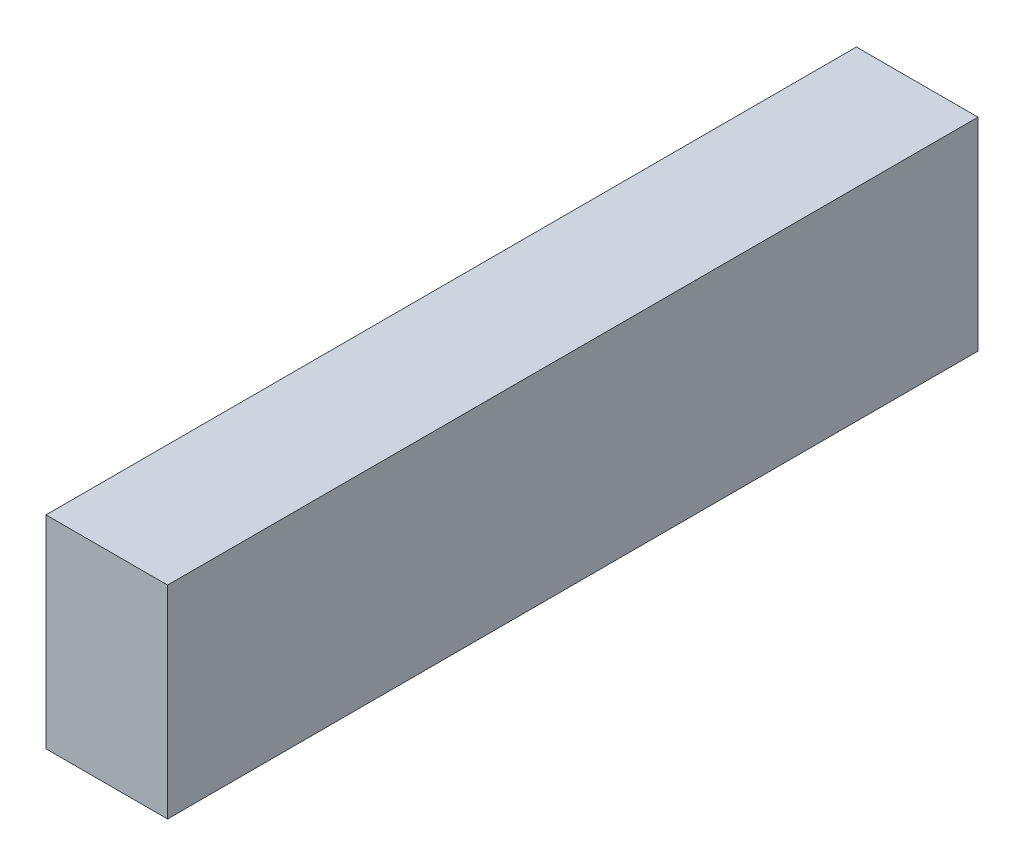
ISO-10303-21;
HEADER;
FILE_DESCRIPTION(('STEP AP214'),'2;1');
FILE_NAME('part.step','',(''),(''),'','','');
FILE_SCHEMA(('AUTOMOTIVE_DESIGN { 1 0 10303 214 1 1 1 1 }'));
ENDSEC;
DATA;
#1=APPLICATION_CONTEXT('core data for automotive mechanical design processes');
#2=APPLICATION_PROTOCOL_DEFINITION('international standard','automotive_design',2000,#1);
#3=PRODUCT_CONTEXT('',#1,'mechanical');
#4=PRODUCT('Part','Part','',(#3));
#5=PRODUCT_RELATED_PRODUCT_CATEGORY('part','',(#4));
#6=PRODUCT_DEFINITION_FORMATION('','',#4);
#7=PRODUCT_DEFINITION_CONTEXT('part definition',#1,'design');
#8=PRODUCT_DEFINITION('design','',#6,#7);
#9=PRODUCT_DEFINITION_SHAPE('','',#8);
#10=(LENGTH_UNIT() NAMED_UNIT(*) SI_UNIT(.MILLI.,.METRE.));
#11=(NAMED_UNIT(*) PLANE_ANGLE_UNIT() SI_UNIT($,.RADIAN.));
#12=(NAMED_UNIT(*) SI_UNIT($,.STERADIAN.) SOLID_ANGLE_UNIT());
#13=UNCERTAINTY_MEASURE_WITH_UNIT(LENGTH_MEASURE(1.E-05),#10,'distance_accuracy_value','');
#14=(GEOMETRIC_REPRESENTATION_CONTEXT(3) GLOBAL_UNCERTAINTY_ASSIGNED_CONTEXT((#13)) GLOBAL_UNIT_ASSIGNED_CONTEXT((#10,
#11,#12)) REPRESENTATION_CONTEXT('',''));
#15=CARTESIAN_POINT('',(0.,0.,0.));
#16=DIRECTION('',(0.,0.,1.));
#17=DIRECTION('',(1.,0.,0.));
#18=AXIS2_PLACEMENT_3D('',#15,#16,#17);
#19=CARTESIAN_POINT('',(15.,25.,200.));
#20=DIRECTION('',(-1.,0.,0.));
#21=DIRECTION('',(0.,-1.,0.));
#22=AXIS2_PLACEMENT_3D('',#19,#20,#21);
#23=PLANE('',#22);
#24=DIRECTION('',(0.,1.,0.));
#25=VECTOR('',#24,1.);
#26=CARTESIAN_POINT('',(15.,25.,0.));
#27=LINE('',#26,#25);
#28=CARTESIAN_POINT('',(15.,-25.,0.));
#29=VERTEX_POINT('',#28);
#30=CARTESIAN_POINT('',(15.,25.,0.));
#31=VERTEX_POINT('',#30);
#32=EDGE_CURVE('E101',#29,#31,#27,.T.);
#33=ORIENTED_EDGE('',*,*,#32,.T.);
#34=DIRECTION('',(0.,0.,-1.));
#35=VECTOR('',#34,1.);
#36=CARTESIAN_POINT('',(15.,25.,200.));
#37=LINE('',#36,#35);
#38=CARTESIAN_POINT('',(15.,25.,200.));
#39=VERTEX_POINT('',#38);
#40=EDGE_CURVE('E11',#39,#31,#37,.T.);
#41=ORIENTED_EDGE('',*,*,#40,.F.);
#42=DIRECTION('',(0.,1.,0.));
#43=VECTOR('',#42,1.);
#44=CARTESIAN_POINT('',(15.,25.,200.));
#45=LINE('',#44,#43);
#46=CARTESIAN_POINT('',(15.,-25.,200.));
#47=VERTEX_POINT('',#46);
#48=EDGE_CURVE('E89',#47,#39,#45,.T.);
#49=ORIENTED_EDGE('',*,*,#48,.F.);
#50=DIRECTION('',(0.,0.,-1.));
#51=VECTOR('',#50,1.);
#52=CARTESIAN_POINT('',(15.,-25.,200.));
#53=LINE('',#52,#51);
#54=EDGE_CURVE('E97',#47,#29,#53,.T.);
#55=ORIENTED_EDGE('',*,*,#54,.T.);
#56=EDGE_LOOP('',(#33,#41,#49,#55));
#57=FACE_BOUND('',#56,.T.);
#58=ADVANCED_FACE('F38',(#57),#23,.F.);
#59=CARTESIAN_POINT('',(-15.,25.,200.));
#60=DIRECTION('',(0.,-1.,0.));
#61=DIRECTION('',(0.,0.,-1.));
#62=AXIS2_PLACEMENT_3D('',#59,#60,#61);
#63=PLANE('',#62);
#64=DIRECTION('',(-1.,0.,0.));
#65=VECTOR('',#64,1.);
#66=CARTESIAN_POINT('',(-15.,25.,0.));
#67=LINE('',#66,#65);
#68=CARTESIAN_POINT('',(-15.,25.,0.));
#69=VERTEX_POINT('',#68);
#70=EDGE_CURVE('E93',#31,#69,#67,.T.);
#71=ORIENTED_EDGE('',*,*,#70,.T.);
#72=DIRECTION('',(0.,0.,-1.));
#73=VECTOR('',#72,1.);
#74=CARTESIAN_POINT('',(-15.,25.,200.));
#75=LINE('',#74,#73);
#76=CARTESIAN_POINT('',(-15.,25.,200.));
#77=VERTEX_POINT('',#76);
#78=EDGE_CURVE('E46',#77,#69,#75,.T.);
#79=ORIENTED_EDGE('',*,*,#78,.F.);
#80=DIRECTION('',(-1.,0.,0.));
#81=VECTOR('',#80,1.);
#82=CARTESIAN_POINT('',(-15.,25.,200.));
#83=LINE('',#82,#81);
#84=EDGE_CURVE('E84',#39,#77,#83,.T.);
#85=ORIENTED_EDGE('',*,*,#84,.F.);
#86=ORIENTED_EDGE('',*,*,#40,.T.);
#87=EDGE_LOOP('',(#71,#79,#85,#86));
#88=FACE_BOUND('',#87,.T.);
#89=ADVANCED_FACE('F92',(#88),#63,.F.);
#90=CARTESIAN_POINT('',(-15.,25.,200.));
#91=DIRECTION('',(1.,0.,0.));
#92=DIRECTION('',(0.,1.,0.));
#93=AXIS2_PLACEMENT_3D('',#90,#91,#92);
#94=PLANE('',#93);
#95=DIRECTION('',(0.,-1.,0.));
#96=VECTOR('',#95,1.);
#97=CARTESIAN_POINT('',(-15.,25.,0.));
#98=LINE('',#97,#96);
#99=CARTESIAN_POINT('',(-15.,-25.,0.));
#100=VERTEX_POINT('',#99);
#101=EDGE_CURVE('E71',#69,#100,#98,.T.);
#102=ORIENTED_EDGE('',*,*,#101,.T.);
#103=DIRECTION('',(0.,0.,-1.));
#104=VECTOR('',#103,1.);
#105=CARTESIAN_POINT('',(-15.,-25.,200.));
#106=LINE('',#105,#104);
#107=CARTESIAN_POINT('',(-15.,-25.,200.));
#108=VERTEX_POINT('',#107);
#109=EDGE_CURVE('E94',#108,#100,#106,.T.);
#110=ORIENTED_EDGE('',*,*,#109,.F.);
#111=DIRECTION('',(0.,-1.,0.));
#112=VECTOR('',#111,1.);
#113=CARTESIAN_POINT('',(-15.,25.,200.));
#114=LINE('',#113,#112);
#115=EDGE_CURVE('E87',#77,#108,#114,.T.);
#116=ORIENTED_EDGE('',*,*,#115,.F.);
#117=ORIENTED_EDGE('',*,*,#78,.T.);
#118=EDGE_LOOP('',(#102,#110,#116,#117));
#119=FACE_BOUND('',#118,.T.);
#120=ADVANCED_FACE('F95',(#119),#94,.F.);
#121=CARTESIAN_POINT('',(-15.,-25.,200.));
#122=DIRECTION('',(0.,1.,0.));
#123=DIRECTION('',(0.,0.,1.));
#124=AXIS2_PLACEMENT_3D('',#121,#122,#123);
#125=PLANE('',#124);
#126=DIRECTION('',(1.,0.,0.));
#127=VECTOR('',#126,1.);
#128=CARTESIAN_POINT('',(-15.,-25.,0.));
#129=LINE('',#128,#127);
#130=EDGE_CURVE('E77',#100,#29,#129,.T.);
#131=ORIENTED_EDGE('',*,*,#130,.T.);
#132=ORIENTED_EDGE('',*,*,#54,.F.);
#133=DIRECTION('',(1.,0.,0.));
#134=VECTOR('',#133,1.);
#135=CARTESIAN_POINT('',(-15.,-25.,200.));
#136=LINE('',#135,#134);
#137=EDGE_CURVE('E54',#108,#47,#136,.T.);
#138=ORIENTED_EDGE('',*,*,#137,.F.);
#139=ORIENTED_EDGE('',*,*,#109,.T.);
#140=EDGE_LOOP('',(#131,#132,#138,#139));
#141=FACE_BOUND('',#140,.T.);
#142=ADVANCED_FACE('F108',(#141),#125,.F.);
#143=CARTESIAN_POINT('',(0.,0.,200.));
#144=DIRECTION('',(0.,0.,1.));
#145=DIRECTION('',(1.,0.,0.));
#146=AXIS2_PLACEMENT_3D('',#143,#144,#145);
#147=PLANE('',#146);
#148=ORIENTED_EDGE('',*,*,#48,.T.);
#149=ORIENTED_EDGE('',*,*,#84,.T.);
#150=ORIENTED_EDGE('',*,*,#115,.T.);
#151=ORIENTED_EDGE('',*,*,#137,.T.);
#152=EDGE_LOOP('',(#148,#149,#150,#151));
#153=FACE_BOUND('',#152,.T.);
#154=ADVANCED_FACE('F85',(#153),#147,.T.);
#155=CARTESIAN_POINT('',(0.,0.,0.));
#156=DIRECTION('',(0.,0.,1.));
#157=DIRECTION('',(1.,0.,0.));
#158=AXIS2_PLACEMENT_3D('',#155,#156,#157);
#159=PLANE('',#158);
#160=ORIENTED_EDGE('',*,*,#32,.F.);
#161=ORIENTED_EDGE('',*,*,#130,.F.);
#162=ORIENTED_EDGE('',*,*,#101,.F.);
#163=ORIENTED_EDGE('',*,*,#70,.F.);
#164=EDGE_LOOP('',(#160,#161,#162,#163));
#165=FACE_BOUND('',#164,.T.);
#166=ADVANCED_FACE('F111',(#165),#159,.F.);
#167=CLOSED_SHELL('',(#58,#89,#120,#142,#154,#166));
#168=MANIFOLD_SOLID_BREP('B2',#167);
#169=ADVANCED_BREP_SHAPE_REPRESENTATION('',(#18,#168),#14);
#170=SHAPE_DEFINITION_REPRESENTATION(#9,#169);
ENDSEC;
END-ISO-10303-21;
